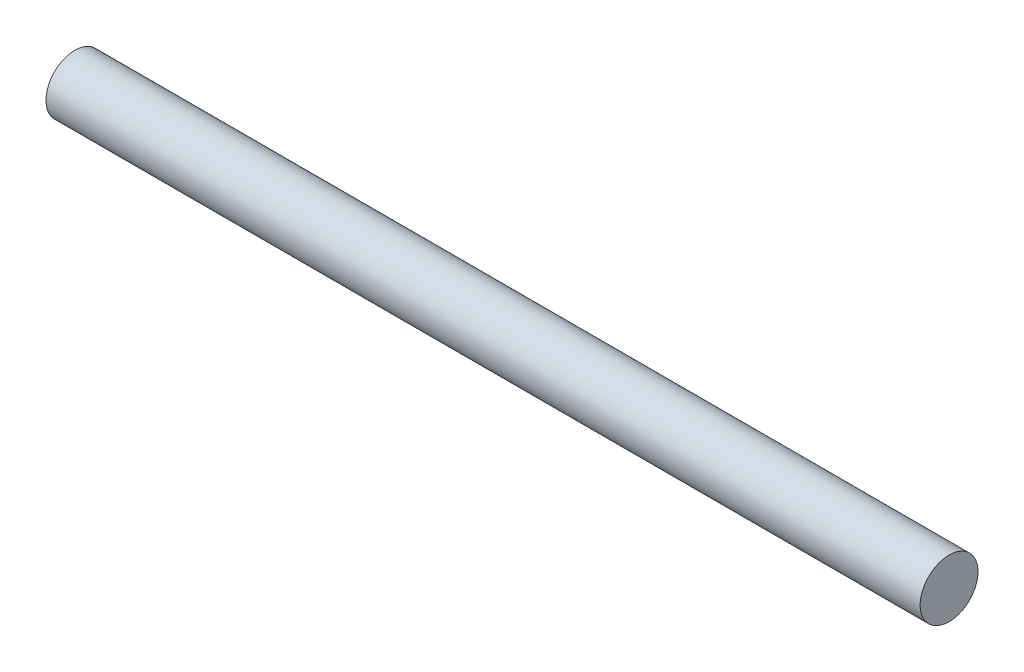
ISO-10303-21;
HEADER;
FILE_DESCRIPTION(('STEP AP214'),'2;1');
FILE_NAME('part.step','',(''),(''),'','','');
FILE_SCHEMA(('AUTOMOTIVE_DESIGN { 1 0 10303 214 1 1 1 1 }'));
ENDSEC;
DATA;
#1=APPLICATION_CONTEXT('core data for automotive mechanical design processes');
#2=APPLICATION_PROTOCOL_DEFINITION('international standard','automotive_design',2000,#1);
#3=PRODUCT_CONTEXT('',#1,'mechanical');
#4=PRODUCT('Part','Part','',(#3));
#5=PRODUCT_RELATED_PRODUCT_CATEGORY('part','',(#4));
#6=PRODUCT_DEFINITION_FORMATION('','',#4);
#7=PRODUCT_DEFINITION_CONTEXT('part definition',#1,'design');
#8=PRODUCT_DEFINITION('design','',#6,#7);
#9=PRODUCT_DEFINITION_SHAPE('','',#8);
#10=(LENGTH_UNIT() NAMED_UNIT(*) SI_UNIT(.MILLI.,.METRE.));
#11=(NAMED_UNIT(*) PLANE_ANGLE_UNIT() SI_UNIT($,.RADIAN.));
#12=(NAMED_UNIT(*) SI_UNIT($,.STERADIAN.) SOLID_ANGLE_UNIT());
#13=UNCERTAINTY_MEASURE_WITH_UNIT(LENGTH_MEASURE(1.E-05),#10,'distance_accuracy_value','');
#14=(GEOMETRIC_REPRESENTATION_CONTEXT(3) GLOBAL_UNCERTAINTY_ASSIGNED_CONTEXT((#13)) GLOBAL_UNIT_ASSIGNED_CONTEXT((#10,
#11,#12)) REPRESENTATION_CONTEXT('',''));
#15=CARTESIAN_POINT('',(0.,0.,0.));
#16=DIRECTION('',(0.,0.,1.));
#17=DIRECTION('',(1.,0.,0.));
#18=AXIS2_PLACEMENT_3D('',#15,#16,#17);
#19=CARTESIAN_POINT('',(60.,0.,0.));
#20=DIRECTION('',(-1.,0.,0.));
#21=DIRECTION('',(0.,0.,1.));
#22=AXIS2_PLACEMENT_3D('',#19,#20,#21);
#23=CYLINDRICAL_SURFACE('',#22,1.985);
#24=CARTESIAN_POINT('',(60.,0.,0.));
#25=DIRECTION('',(1.,0.,0.));
#26=DIRECTION('',(0.,0.,-1.));
#27=AXIS2_PLACEMENT_3D('',#24,#25,#26);
#28=CIRCLE('',#27,1.985);
#29=CARTESIAN_POINT('',(60.,0.,-1.985));
#30=VERTEX_POINT('',#29);
#31=EDGE_CURVE('E10',#30,#30,#28,.T.);
#32=ORIENTED_EDGE('',*,*,#31,.F.);
#33=EDGE_LOOP('',(#32));
#34=FACE_BOUND('',#33,.T.);
#35=CARTESIAN_POINT('',(0.,0.,0.));
#36=DIRECTION('',(1.,0.,0.));
#37=DIRECTION('',(0.,0.,-1.));
#38=AXIS2_PLACEMENT_3D('',#35,#36,#37);
#39=CIRCLE('',#38,1.985);
#40=CARTESIAN_POINT('',(0.,0.,-1.985));
#41=VERTEX_POINT('',#40);
#42=EDGE_CURVE('E42',#41,#41,#39,.T.);
#43=ORIENTED_EDGE('',*,*,#42,.T.);
#44=EDGE_LOOP('',(#43));
#45=FACE_BOUND('',#44,.T.);
#46=ADVANCED_FACE('F39',(#34,#45),#23,.T.);
#47=CARTESIAN_POINT('',(60.,0.,0.));
#48=DIRECTION('',(1.,0.,0.));
#49=DIRECTION('',(0.,0.,-1.));
#50=AXIS2_PLACEMENT_3D('',#47,#48,#49);
#51=PLANE('',#50);
#52=ORIENTED_EDGE('',*,*,#31,.T.);
#53=EDGE_LOOP('',(#52));
#54=FACE_BOUND('',#53,.T.);
#55=ADVANCED_FACE('F54',(#54),#51,.T.);
#56=CARTESIAN_POINT('',(0.,0.,0.));
#57=DIRECTION('',(1.,0.,0.));
#58=DIRECTION('',(0.,0.,-1.));
#59=AXIS2_PLACEMENT_3D('',#56,#57,#58);
#60=PLANE('',#59);
#61=ORIENTED_EDGE('',*,*,#42,.F.);
#62=EDGE_LOOP('',(#61));
#63=FACE_BOUND('',#62,.T.);
#64=ADVANCED_FACE('F52',(#63),#60,.F.);
#65=CLOSED_SHELL('',(#46,#55,#64));
#66=MANIFOLD_SOLID_BREP('B2',#65);
#67=ADVANCED_BREP_SHAPE_REPRESENTATION('',(#18,#66),#14);
#68=SHAPE_DEFINITION_REPRESENTATION(#9,#67);
ENDSEC;
END-ISO-10303-21;
